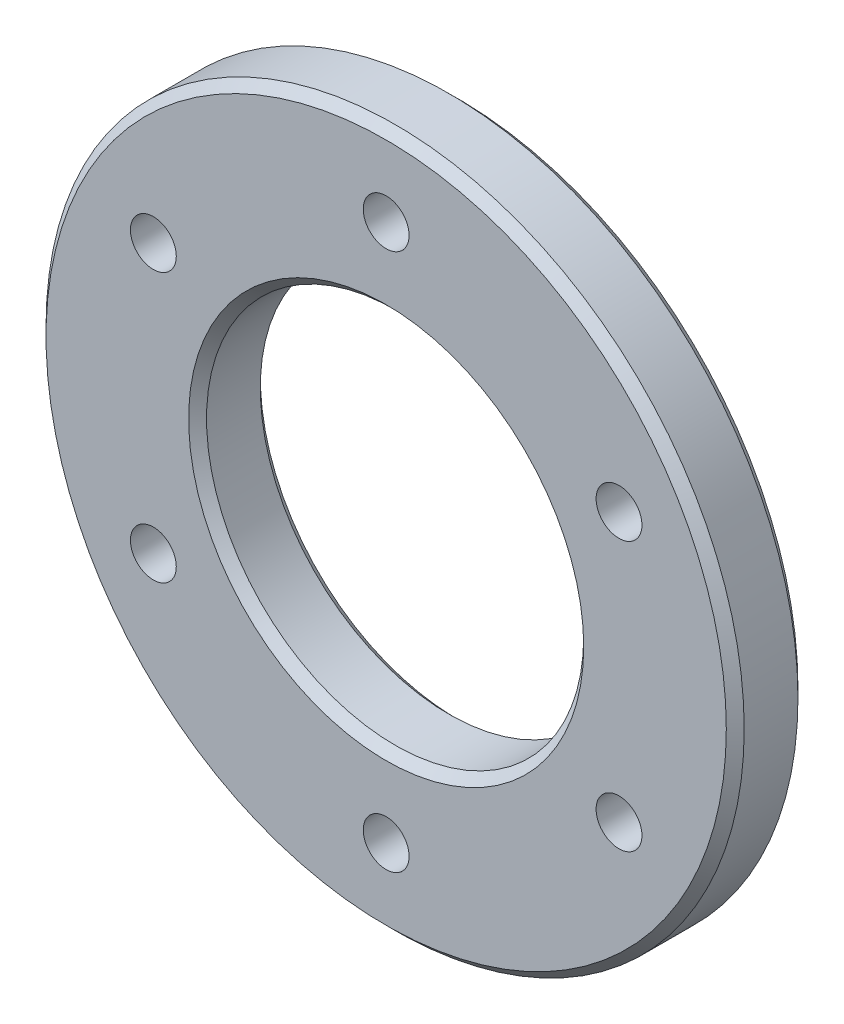
ISO-10303-21;
HEADER;
FILE_DESCRIPTION(('STEP AP214'),'2;1');
FILE_NAME('part.step','',(''),(''),'','','');
FILE_SCHEMA(('AUTOMOTIVE_DESIGN { 1 0 10303 214 1 1 1 1 }'));
ENDSEC;
DATA;
#1=APPLICATION_CONTEXT('core data for automotive mechanical design processes');
#2=APPLICATION_PROTOCOL_DEFINITION('international standard','automotive_design',2000,#1);
#3=PRODUCT_CONTEXT('',#1,'mechanical');
#4=PRODUCT('Part','Part','',(#3));
#5=PRODUCT_RELATED_PRODUCT_CATEGORY('part','',(#4));
#6=PRODUCT_DEFINITION_FORMATION('','',#4);
#7=PRODUCT_DEFINITION_CONTEXT('part definition',#1,'design');
#8=PRODUCT_DEFINITION('design','',#6,#7);
#9=PRODUCT_DEFINITION_SHAPE('','',#8);
#10=(LENGTH_UNIT() NAMED_UNIT(*) SI_UNIT(.MILLI.,.METRE.));
#11=(NAMED_UNIT(*) PLANE_ANGLE_UNIT() SI_UNIT($,.RADIAN.));
#12=(NAMED_UNIT(*) SI_UNIT($,.STERADIAN.) SOLID_ANGLE_UNIT());
#13=UNCERTAINTY_MEASURE_WITH_UNIT(LENGTH_MEASURE(1.E-05),#10,'distance_accuracy_value','');
#14=(GEOMETRIC_REPRESENTATION_CONTEXT(3) GLOBAL_UNCERTAINTY_ASSIGNED_CONTEXT((#13)) GLOBAL_UNIT_ASSIGNED_CONTEXT((#10,
#11,#12)) REPRESENTATION_CONTEXT('',''));
#15=CARTESIAN_POINT('',(0.,0.,0.));
#16=DIRECTION('',(0.,0.,1.));
#17=DIRECTION('',(1.,0.,0.));
#18=AXIS2_PLACEMENT_3D('',#15,#16,#17);
#19=CARTESIAN_POINT('',(0.,0.,6.35));
#20=DIRECTION('',(0.,0.,1.));
#21=DIRECTION('',(1.,0.,0.));
#22=AXIS2_PLACEMENT_3D('',#19,#20,#21);
#23=PLANE('',#22);
#24=CARTESIAN_POINT('',(0.,0.,6.35));
#25=DIRECTION('',(0.,0.,1.));
#26=DIRECTION('',(1.,0.,0.));
#27=AXIS2_PLACEMENT_3D('',#24,#25,#26);
#28=CIRCLE('',#27,17.50695);
#29=CARTESIAN_POINT('',(17.50695,0.,6.35));
#30=VERTEX_POINT('',#29);
#31=EDGE_CURVE('E10',#30,#30,#28,.F.);
#32=ORIENTED_EDGE('',*,*,#31,.T.);
#33=EDGE_LOOP('',(#32));
#34=FACE_BOUND('',#33,.T.);
#35=CARTESIAN_POINT('',(0.,0.,6.35));
#36=DIRECTION('',(0.,0.,1.));
#37=DIRECTION('',(1.,0.,0.));
#38=AXIS2_PLACEMENT_3D('',#35,#36,#37);
#39=CIRCLE('',#38,30.14345);
#40=CARTESIAN_POINT('',(30.14345,0.,6.35));
#41=VERTEX_POINT('',#40);
#42=EDGE_CURVE('E38',#41,#41,#39,.T.);
#43=ORIENTED_EDGE('',*,*,#42,.T.);
#44=EDGE_LOOP('',(#43));
#45=FACE_BOUND('',#44,.T.);
#46=CARTESIAN_POINT('',(-20.633228450245,-11.9126,6.35));
#47=DIRECTION('',(0.,0.,1.));
#48=DIRECTION('',(1.,0.,0.));
#49=AXIS2_PLACEMENT_3D('',#46,#47,#48);
#50=CIRCLE('',#49,2.032);
#51=CARTESIAN_POINT('',(-18.601228450245,-11.9126,6.35));
#52=VERTEX_POINT('',#51);
#53=EDGE_CURVE('E85',#52,#52,#50,.T.);
#54=ORIENTED_EDGE('',*,*,#53,.F.);
#55=EDGE_LOOP('',(#54));
#56=FACE_BOUND('',#55,.T.);
#57=CARTESIAN_POINT('',(20.633228450245,-11.9126,6.35));
#58=DIRECTION('',(0.,0.,1.));
#59=DIRECTION('',(1.,0.,0.));
#60=AXIS2_PLACEMENT_3D('',#57,#58,#59);
#61=CIRCLE('',#60,2.032);
#62=CARTESIAN_POINT('',(22.665228450245,-11.9126,6.35));
#63=VERTEX_POINT('',#62);
#64=EDGE_CURVE('E73',#63,#63,#61,.T.);
#65=ORIENTED_EDGE('',*,*,#64,.F.);
#66=EDGE_LOOP('',(#65));
#67=FACE_BOUND('',#66,.T.);
#68=CARTESIAN_POINT('',(0.,23.8252,6.35));
#69=DIRECTION('',(0.,0.,1.));
#70=DIRECTION('',(1.,0.,0.));
#71=AXIS2_PLACEMENT_3D('',#68,#69,#70);
#72=CIRCLE('',#71,2.032);
#73=CARTESIAN_POINT('',(2.032,23.8252,6.35));
#74=VERTEX_POINT('',#73);
#75=EDGE_CURVE('E63',#74,#74,#72,.T.);
#76=ORIENTED_EDGE('',*,*,#75,.F.);
#77=EDGE_LOOP('',(#76));
#78=FACE_BOUND('',#77,.T.);
#79=CARTESIAN_POINT('',(20.633228450245,11.9126,6.35));
#80=DIRECTION('',(0.,0.,1.));
#81=DIRECTION('',(1.,0.,0.));
#82=AXIS2_PLACEMENT_3D('',#79,#80,#81);
#83=CIRCLE('',#82,2.032);
#84=CARTESIAN_POINT('',(22.665228450245,11.9126,6.35));
#85=VERTEX_POINT('',#84);
#86=EDGE_CURVE('E67',#85,#85,#83,.T.);
#87=ORIENTED_EDGE('',*,*,#86,.F.);
#88=EDGE_LOOP('',(#87));
#89=FACE_BOUND('',#88,.T.);
#90=CARTESIAN_POINT('',(0.,-23.8252,6.35));
#91=DIRECTION('',(0.,0.,1.));
#92=DIRECTION('',(1.,0.,0.));
#93=AXIS2_PLACEMENT_3D('',#90,#91,#92);
#94=CIRCLE('',#93,2.032);
#95=CARTESIAN_POINT('',(2.032,-23.8252,6.35));
#96=VERTEX_POINT('',#95);
#97=EDGE_CURVE('E79',#96,#96,#94,.T.);
#98=ORIENTED_EDGE('',*,*,#97,.F.);
#99=EDGE_LOOP('',(#98));
#100=FACE_BOUND('',#99,.T.);
#101=CARTESIAN_POINT('',(-20.633228450245,11.9126,6.35));
#102=DIRECTION('',(0.,0.,1.));
#103=DIRECTION('',(1.,0.,0.));
#104=AXIS2_PLACEMENT_3D('',#101,#102,#103);
#105=CIRCLE('',#104,2.032);
#106=CARTESIAN_POINT('',(-18.601228450245,11.9126,6.35));
#107=VERTEX_POINT('',#106);
#108=EDGE_CURVE('E91',#107,#107,#105,.T.);
#109=ORIENTED_EDGE('',*,*,#108,.F.);
#110=EDGE_LOOP('',(#109));
#111=FACE_BOUND('',#110,.T.);
#112=ADVANCED_FACE('F31',(#34,#45,#56,#67,#78,#89,#100,#111),#23,.T.);
#113=CARTESIAN_POINT('',(0.,0.,0.));
#114=DIRECTION('',(0.,0.,1.));
#115=DIRECTION('',(1.,0.,0.));
#116=AXIS2_PLACEMENT_3D('',#113,#114,#115);
#117=PLANE('',#116);
#118=CARTESIAN_POINT('',(0.,0.,0.));
#119=DIRECTION('',(0.,0.,1.));
#120=DIRECTION('',(1.,0.,0.));
#121=AXIS2_PLACEMENT_3D('',#118,#119,#120);
#122=CIRCLE('',#121,30.14345);
#123=CARTESIAN_POINT('',(30.14345,0.,0.));
#124=VERTEX_POINT('',#123);
#125=EDGE_CURVE('E51',#124,#124,#122,.F.);
#126=ORIENTED_EDGE('',*,*,#125,.T.);
#127=EDGE_LOOP('',(#126));
#128=FACE_BOUND('',#127,.T.);
#129=CARTESIAN_POINT('',(0.,0.,0.));
#130=DIRECTION('',(0.,0.,1.));
#131=DIRECTION('',(1.,0.,0.));
#132=AXIS2_PLACEMENT_3D('',#129,#130,#131);
#133=CIRCLE('',#132,17.50695);
#134=CARTESIAN_POINT('',(17.50695,0.,0.));
#135=VERTEX_POINT('',#134);
#136=EDGE_CURVE('E54',#135,#135,#133,.T.);
#137=ORIENTED_EDGE('',*,*,#136,.T.);
#138=EDGE_LOOP('',(#137));
#139=FACE_BOUND('',#138,.T.);
#140=CARTESIAN_POINT('',(0.,23.8252,0.));
#141=DIRECTION('',(0.,0.,1.));
#142=DIRECTION('',(1.,0.,0.));
#143=AXIS2_PLACEMENT_3D('',#140,#141,#142);
#144=CIRCLE('',#143,2.032);
#145=CARTESIAN_POINT('',(2.032,23.8252,0.));
#146=VERTEX_POINT('',#145);
#147=EDGE_CURVE('E64',#146,#146,#144,.T.);
#148=ORIENTED_EDGE('',*,*,#147,.T.);
#149=EDGE_LOOP('',(#148));
#150=FACE_BOUND('',#149,.T.);
#151=CARTESIAN_POINT('',(20.633228450245,11.9126,0.));
#152=DIRECTION('',(0.,0.,1.));
#153=DIRECTION('',(1.,0.,0.));
#154=AXIS2_PLACEMENT_3D('',#151,#152,#153);
#155=CIRCLE('',#154,2.032);
#156=CARTESIAN_POINT('',(22.665228450245,11.9126,0.));
#157=VERTEX_POINT('',#156);
#158=EDGE_CURVE('E70',#157,#157,#155,.T.);
#159=ORIENTED_EDGE('',*,*,#158,.T.);
#160=EDGE_LOOP('',(#159));
#161=FACE_BOUND('',#160,.T.);
#162=CARTESIAN_POINT('',(20.633228450245,-11.9126,0.));
#163=DIRECTION('',(0.,0.,1.));
#164=DIRECTION('',(1.,0.,0.));
#165=AXIS2_PLACEMENT_3D('',#162,#163,#164);
#166=CIRCLE('',#165,2.032);
#167=CARTESIAN_POINT('',(22.665228450245,-11.9126,0.));
#168=VERTEX_POINT('',#167);
#169=EDGE_CURVE('E76',#168,#168,#166,.T.);
#170=ORIENTED_EDGE('',*,*,#169,.T.);
#171=EDGE_LOOP('',(#170));
#172=FACE_BOUND('',#171,.T.);
#173=CARTESIAN_POINT('',(0.,-23.8252,0.));
#174=DIRECTION('',(0.,0.,1.));
#175=DIRECTION('',(1.,0.,0.));
#176=AXIS2_PLACEMENT_3D('',#173,#174,#175);
#177=CIRCLE('',#176,2.032);
#178=CARTESIAN_POINT('',(2.032,-23.8252,0.));
#179=VERTEX_POINT('',#178);
#180=EDGE_CURVE('E82',#179,#179,#177,.T.);
#181=ORIENTED_EDGE('',*,*,#180,.T.);
#182=EDGE_LOOP('',(#181));
#183=FACE_BOUND('',#182,.T.);
#184=CARTESIAN_POINT('',(-20.633228450245,-11.9126,0.));
#185=DIRECTION('',(0.,0.,1.));
#186=DIRECTION('',(1.,0.,0.));
#187=AXIS2_PLACEMENT_3D('',#184,#185,#186);
#188=CIRCLE('',#187,2.032);
#189=CARTESIAN_POINT('',(-18.601228450245,-11.9126,0.));
#190=VERTEX_POINT('',#189);
#191=EDGE_CURVE('E88',#190,#190,#188,.T.);
#192=ORIENTED_EDGE('',*,*,#191,.T.);
#193=EDGE_LOOP('',(#192));
#194=FACE_BOUND('',#193,.T.);
#195=CARTESIAN_POINT('',(-20.633228450245,11.9126,0.));
#196=DIRECTION('',(0.,0.,1.));
#197=DIRECTION('',(1.,0.,0.));
#198=AXIS2_PLACEMENT_3D('',#195,#196,#197);
#199=CIRCLE('',#198,2.032);
#200=CARTESIAN_POINT('',(-18.601228450245,11.9126,0.));
#201=VERTEX_POINT('',#200);
#202=EDGE_CURVE('E94',#201,#201,#199,.T.);
#203=ORIENTED_EDGE('',*,*,#202,.T.);
#204=EDGE_LOOP('',(#203));
#205=FACE_BOUND('',#204,.T.);
#206=ADVANCED_FACE('F104',(#128,#139,#150,#161,#172,#183,#194,#205),#117,.F.);
#207=CARTESIAN_POINT('',(0.,0.,6.35));
#208=DIRECTION('',(0.,0.,-1.));
#209=DIRECTION('',(-1.,0.,0.));
#210=AXIS2_PLACEMENT_3D('',#207,#208,#209);
#211=CYLINDRICAL_SURFACE('',#210,30.9372);
#212=CARTESIAN_POINT('',(0.,0.,0.793750000000006));
#213=DIRECTION('',(0.,0.,1.));
#214=DIRECTION('',(1.,0.,0.));
#215=AXIS2_PLACEMENT_3D('',#212,#213,#214);
#216=CIRCLE('',#215,30.9372);
#217=CARTESIAN_POINT('',(30.9372,0.,0.793750000000006));
#218=VERTEX_POINT('',#217);
#219=EDGE_CURVE('E57',#218,#218,#216,.T.);
#220=ORIENTED_EDGE('',*,*,#219,.T.);
#221=EDGE_LOOP('',(#220));
#222=FACE_BOUND('',#221,.T.);
#223=CARTESIAN_POINT('',(0.,0.,5.55625000000002));
#224=DIRECTION('',(0.,0.,1.));
#225=DIRECTION('',(1.,0.,0.));
#226=AXIS2_PLACEMENT_3D('',#223,#224,#225);
#227=CIRCLE('',#226,30.9372);
#228=CARTESIAN_POINT('',(30.9372,0.,5.55625000000002));
#229=VERTEX_POINT('',#228);
#230=EDGE_CURVE('E60',#229,#229,#227,.F.);
#231=ORIENTED_EDGE('',*,*,#230,.T.);
#232=EDGE_LOOP('',(#231));
#233=FACE_BOUND('',#232,.T.);
#234=ADVANCED_FACE('F109',(#222,#233),#211,.T.);
#235=CARTESIAN_POINT('',(0.,23.8252,6.35));
#236=DIRECTION('',(0.,0.,-1.));
#237=DIRECTION('',(-1.,0.,0.));
#238=AXIS2_PLACEMENT_3D('',#235,#236,#237);
#239=CYLINDRICAL_SURFACE('',#238,2.032);
#240=ORIENTED_EDGE('',*,*,#75,.T.);
#241=EDGE_LOOP('',(#240));
#242=FACE_BOUND('',#241,.T.);
#243=ORIENTED_EDGE('',*,*,#147,.F.);
#244=EDGE_LOOP('',(#243));
#245=FACE_BOUND('',#244,.T.);
#246=ADVANCED_FACE('F113',(#242,#245),#239,.F.);
#247=CARTESIAN_POINT('',(0.,0.,6.35));
#248=DIRECTION('',(0.,0.,-1.));
#249=DIRECTION('',(-1.,0.,0.));
#250=AXIS2_PLACEMENT_3D('',#247,#248,#249);
#251=CYLINDRICAL_SURFACE('',#250,16.7132);
#252=CARTESIAN_POINT('',(0.,0.,0.793750000000013));
#253=DIRECTION('',(0.,0.,1.));
#254=DIRECTION('',(1.,0.,0.));
#255=AXIS2_PLACEMENT_3D('',#252,#253,#254);
#256=CIRCLE('',#255,16.7132);
#257=CARTESIAN_POINT('',(16.7132,0.,0.793750000000013));
#258=VERTEX_POINT('',#257);
#259=EDGE_CURVE('E42',#258,#258,#256,.F.);
#260=ORIENTED_EDGE('',*,*,#259,.T.);
#261=EDGE_LOOP('',(#260));
#262=FACE_BOUND('',#261,.T.);
#263=CARTESIAN_POINT('',(0.,0.,5.55625000000001));
#264=DIRECTION('',(0.,0.,1.));
#265=DIRECTION('',(1.,0.,0.));
#266=AXIS2_PLACEMENT_3D('',#263,#264,#265);
#267=CIRCLE('',#266,16.7132);
#268=CARTESIAN_POINT('',(16.7132,0.,5.55625000000001));
#269=VERTEX_POINT('',#268);
#270=EDGE_CURVE('E46',#269,#269,#267,.T.);
#271=ORIENTED_EDGE('',*,*,#270,.T.);
#272=EDGE_LOOP('',(#271));
#273=FACE_BOUND('',#272,.T.);
#274=ADVANCED_FACE('F136',(#262,#273),#251,.F.);
#275=CARTESIAN_POINT('',(20.633228450245,11.9126,6.35));
#276=DIRECTION('',(0.,0.,-1.));
#277=DIRECTION('',(-1.,0.,0.));
#278=AXIS2_PLACEMENT_3D('',#275,#276,#277);
#279=CYLINDRICAL_SURFACE('',#278,2.032);
#280=ORIENTED_EDGE('',*,*,#86,.T.);
#281=EDGE_LOOP('',(#280));
#282=FACE_BOUND('',#281,.T.);
#283=ORIENTED_EDGE('',*,*,#158,.F.);
#284=EDGE_LOOP('',(#283));
#285=FACE_BOUND('',#284,.T.);
#286=ADVANCED_FACE('F138',(#282,#285),#279,.F.);
#287=CARTESIAN_POINT('',(20.633228450245,-11.9126,6.35));
#288=DIRECTION('',(0.,0.,-1.));
#289=DIRECTION('',(-1.,0.,0.));
#290=AXIS2_PLACEMENT_3D('',#287,#288,#289);
#291=CYLINDRICAL_SURFACE('',#290,2.032);
#292=ORIENTED_EDGE('',*,*,#64,.T.);
#293=EDGE_LOOP('',(#292));
#294=FACE_BOUND('',#293,.T.);
#295=ORIENTED_EDGE('',*,*,#169,.F.);
#296=EDGE_LOOP('',(#295));
#297=FACE_BOUND('',#296,.T.);
#298=ADVANCED_FACE('F144',(#294,#297),#291,.F.);
#299=CARTESIAN_POINT('',(0.,-23.8252,6.35));
#300=DIRECTION('',(0.,0.,-1.));
#301=DIRECTION('',(-1.,0.,0.));
#302=AXIS2_PLACEMENT_3D('',#299,#300,#301);
#303=CYLINDRICAL_SURFACE('',#302,2.032);
#304=ORIENTED_EDGE('',*,*,#97,.T.);
#305=EDGE_LOOP('',(#304));
#306=FACE_BOUND('',#305,.T.);
#307=ORIENTED_EDGE('',*,*,#180,.F.);
#308=EDGE_LOOP('',(#307));
#309=FACE_BOUND('',#308,.T.);
#310=ADVANCED_FACE('F151',(#306,#309),#303,.F.);
#311=CARTESIAN_POINT('',(-20.633228450245,-11.9126,6.35));
#312=DIRECTION('',(0.,0.,-1.));
#313=DIRECTION('',(-1.,0.,0.));
#314=AXIS2_PLACEMENT_3D('',#311,#312,#313);
#315=CYLINDRICAL_SURFACE('',#314,2.032);
#316=ORIENTED_EDGE('',*,*,#53,.T.);
#317=EDGE_LOOP('',(#316));
#318=FACE_BOUND('',#317,.T.);
#319=ORIENTED_EDGE('',*,*,#191,.F.);
#320=EDGE_LOOP('',(#319));
#321=FACE_BOUND('',#320,.T.);
#322=ADVANCED_FACE('F155',(#318,#321),#315,.F.);
#323=CARTESIAN_POINT('',(-20.633228450245,11.9126,6.35));
#324=DIRECTION('',(0.,0.,-1.));
#325=DIRECTION('',(-1.,0.,0.));
#326=AXIS2_PLACEMENT_3D('',#323,#324,#325);
#327=CYLINDRICAL_SURFACE('',#326,2.032);
#328=ORIENTED_EDGE('',*,*,#108,.T.);
#329=EDGE_LOOP('',(#328));
#330=FACE_BOUND('',#329,.T.);
#331=ORIENTED_EDGE('',*,*,#202,.F.);
#332=EDGE_LOOP('',(#331));
#333=FACE_BOUND('',#332,.T.);
#334=ADVANCED_FACE('F100',(#330,#333),#327,.F.);
#335=CARTESIAN_POINT('',(0.,0.,0.793750000000006));
#336=DIRECTION('',(0.,0.,1.));
#337=DIRECTION('',(1.,0.,0.));
#338=AXIS2_PLACEMENT_3D('',#335,#336,#337);
#339=CONICAL_SURFACE('',#338,30.9372,0.78539816339745);
#340=ORIENTED_EDGE('',*,*,#125,.F.);
#341=EDGE_LOOP('',(#340));
#342=FACE_BOUND('',#341,.T.);
#343=ORIENTED_EDGE('',*,*,#219,.F.);
#344=EDGE_LOOP('',(#343));
#345=FACE_BOUND('',#344,.T.);
#346=ADVANCED_FACE('F119',(#342,#345),#339,.T.);
#347=CARTESIAN_POINT('',(0.,0.,0.));
#348=DIRECTION('',(0.,0.,-1.));
#349=DIRECTION('',(-1.,0.,0.));
#350=AXIS2_PLACEMENT_3D('',#347,#348,#349);
#351=CONICAL_SURFACE('',#350,17.50695,0.785398163397448);
#352=ORIENTED_EDGE('',*,*,#259,.F.);
#353=EDGE_LOOP('',(#352));
#354=FACE_BOUND('',#353,.T.);
#355=ORIENTED_EDGE('',*,*,#136,.F.);
#356=EDGE_LOOP('',(#355));
#357=FACE_BOUND('',#356,.T.);
#358=ADVANCED_FACE('F122',(#354,#357),#351,.F.);
#359=CARTESIAN_POINT('',(0.,0.,5.55625000000001));
#360=DIRECTION('',(0.,0.,1.));
#361=DIRECTION('',(1.,0.,0.));
#362=AXIS2_PLACEMENT_3D('',#359,#360,#361);
#363=CONICAL_SURFACE('',#362,16.7132,0.78539816339745);
#364=ORIENTED_EDGE('',*,*,#31,.F.);
#365=EDGE_LOOP('',(#364));
#366=FACE_BOUND('',#365,.T.);
#367=ORIENTED_EDGE('',*,*,#270,.F.);
#368=EDGE_LOOP('',(#367));
#369=FACE_BOUND('',#368,.T.);
#370=ADVANCED_FACE('F125',(#366,#369),#363,.F.);
#371=CARTESIAN_POINT('',(0.,0.,6.35));
#372=DIRECTION('',(0.,0.,-1.));
#373=DIRECTION('',(-1.,0.,0.));
#374=AXIS2_PLACEMENT_3D('',#371,#372,#373);
#375=CONICAL_SURFACE('',#374,30.14345,0.78539816339745);
#376=ORIENTED_EDGE('',*,*,#230,.F.);
#377=EDGE_LOOP('',(#376));
#378=FACE_BOUND('',#377,.T.);
#379=ORIENTED_EDGE('',*,*,#42,.F.);
#380=EDGE_LOOP('',(#379));
#381=FACE_BOUND('',#380,.T.);
#382=ADVANCED_FACE('F33',(#378,#381),#375,.T.);
#383=CLOSED_SHELL('',(#112,#206,#234,#246,#274,#286,#298,#310,#322,#334,#346,#358,#370,#382));
#384=MANIFOLD_SOLID_BREP('B2',#383);
#385=ADVANCED_BREP_SHAPE_REPRESENTATION('',(#18,#384),#14);
#386=SHAPE_DEFINITION_REPRESENTATION(#9,#385);
ENDSEC;
END-ISO-10303-21;
